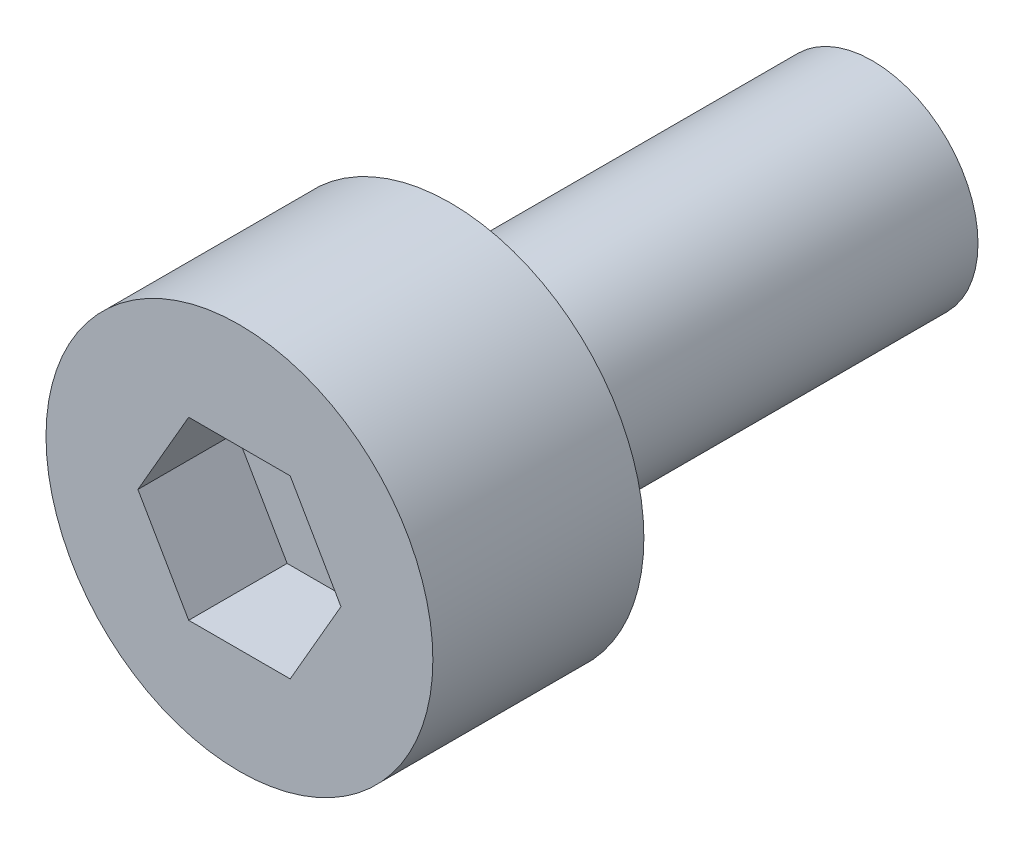
ISO-10303-21;
HEADER;
FILE_DESCRIPTION(('STEP AP214'),'2;1');
FILE_NAME('part.step','',(''),(''),'','','');
FILE_SCHEMA(('AUTOMOTIVE_DESIGN { 1 0 10303 214 1 1 1 1 }'));
ENDSEC;
DATA;
#1=APPLICATION_CONTEXT('core data for automotive mechanical design processes');
#2=APPLICATION_PROTOCOL_DEFINITION('international standard','automotive_design',2000,#1);
#3=PRODUCT_CONTEXT('',#1,'mechanical');
#4=PRODUCT('Part','Part','',(#3));
#5=PRODUCT_RELATED_PRODUCT_CATEGORY('part','',(#4));
#6=PRODUCT_DEFINITION_FORMATION('','',#4);
#7=PRODUCT_DEFINITION_CONTEXT('part definition',#1,'design');
#8=PRODUCT_DEFINITION('design','',#6,#7);
#9=PRODUCT_DEFINITION_SHAPE('','',#8);
#10=(LENGTH_UNIT() NAMED_UNIT(*) SI_UNIT(.MILLI.,.METRE.));
#11=(NAMED_UNIT(*) PLANE_ANGLE_UNIT() SI_UNIT($,.RADIAN.));
#12=(NAMED_UNIT(*) SI_UNIT($,.STERADIAN.) SOLID_ANGLE_UNIT());
#13=UNCERTAINTY_MEASURE_WITH_UNIT(LENGTH_MEASURE(1.E-05),#10,'distance_accuracy_value','');
#14=(GEOMETRIC_REPRESENTATION_CONTEXT(3) GLOBAL_UNCERTAINTY_ASSIGNED_CONTEXT((#13)) GLOBAL_UNIT_ASSIGNED_CONTEXT((#10,
#11,#12)) REPRESENTATION_CONTEXT('',''));
#15=CARTESIAN_POINT('',(0.,0.,0.));
#16=DIRECTION('',(0.,0.,1.));
#17=DIRECTION('',(1.,0.,0.));
#18=AXIS2_PLACEMENT_3D('',#15,#16,#17);
#19=CARTESIAN_POINT('',(0.,0.,3.));
#20=DIRECTION('',(0.,0.,1.));
#21=DIRECTION('',(1.,0.,0.));
#22=AXIS2_PLACEMENT_3D('',#19,#20,#21);
#23=PLANE('',#22);
#24=CARTESIAN_POINT('',(0.,0.,3.));
#25=DIRECTION('',(0.,0.,1.));
#26=DIRECTION('',(1.,0.,0.));
#27=AXIS2_PLACEMENT_3D('',#24,#25,#26);
#28=CIRCLE('',#27,2.75);
#29=CARTESIAN_POINT('',(2.75,0.,3.));
#30=VERTEX_POINT('',#29);
#31=EDGE_CURVE('E11',#30,#30,#28,.T.);
#32=ORIENTED_EDGE('',*,*,#31,.T.);
#33=EDGE_LOOP('',(#32));
#34=FACE_BOUND('',#33,.T.);
#35=DIRECTION('',(-0.5,0.866025403784439,0.));
#36=VECTOR('',#35,1.);
#37=CARTESIAN_POINT('',(1.44337567297406,0.,3.));
#38=LINE('',#37,#36);
#39=CARTESIAN_POINT('',(1.44337567297406,0.,3.));
#40=VERTEX_POINT('',#39);
#41=CARTESIAN_POINT('',(0.721687836487032,1.25,3.));
#42=VERTEX_POINT('',#41);
#43=EDGE_CURVE('E124',#40,#42,#38,.T.);
#44=ORIENTED_EDGE('',*,*,#43,.F.);
#45=DIRECTION('',(0.5,0.866025403784439,0.));
#46=VECTOR('',#45,1.);
#47=CARTESIAN_POINT('',(0.721687836487032,-1.25,3.));
#48=LINE('',#47,#46);
#49=CARTESIAN_POINT('',(0.721687836487032,-1.25,3.));
#50=VERTEX_POINT('',#49);
#51=EDGE_CURVE('E101',#50,#40,#48,.T.);
#52=ORIENTED_EDGE('',*,*,#51,.F.);
#53=DIRECTION('',(1.,0.,0.));
#54=VECTOR('',#53,1.);
#55=CARTESIAN_POINT('',(-0.721687836487033,-1.25,3.));
#56=LINE('',#55,#54);
#57=CARTESIAN_POINT('',(-0.721687836487033,-1.25,3.));
#58=VERTEX_POINT('',#57);
#59=EDGE_CURVE('E70',#58,#50,#56,.T.);
#60=ORIENTED_EDGE('',*,*,#59,.F.);
#61=DIRECTION('',(0.5,-0.866025403784439,0.));
#62=VECTOR('',#61,1.);
#63=CARTESIAN_POINT('',(-1.44337567297406,0.,3.));
#64=LINE('',#63,#62);
#65=CARTESIAN_POINT('',(-1.44337567297406,0.,3.));
#66=VERTEX_POINT('',#65);
#67=EDGE_CURVE('E135',#66,#58,#64,.T.);
#68=ORIENTED_EDGE('',*,*,#67,.F.);
#69=DIRECTION('',(-0.5,-0.866025403784439,0.));
#70=VECTOR('',#69,1.);
#71=CARTESIAN_POINT('',(-0.721687836487032,1.25,3.));
#72=LINE('',#71,#70);
#73=CARTESIAN_POINT('',(-0.721687836487032,1.25,3.));
#74=VERTEX_POINT('',#73);
#75=EDGE_CURVE('E122',#74,#66,#72,.T.);
#76=ORIENTED_EDGE('',*,*,#75,.F.);
#77=DIRECTION('',(-1.,0.,0.));
#78=VECTOR('',#77,1.);
#79=CARTESIAN_POINT('',(0.721687836487032,1.25,3.));
#80=LINE('',#79,#78);
#81=EDGE_CURVE('E109',#42,#74,#80,.T.);
#82=ORIENTED_EDGE('',*,*,#81,.F.);
#83=EDGE_LOOP('',(#44,#52,#60,#68,#76,#82));
#84=FACE_BOUND('',#83,.T.);
#85=ADVANCED_FACE('F50',(#34,#84),#23,.T.);
#86=CARTESIAN_POINT('',(0.,0.,3.));
#87=DIRECTION('',(0.,0.,-1.));
#88=DIRECTION('',(-1.,0.,0.));
#89=AXIS2_PLACEMENT_3D('',#86,#87,#88);
#90=CYLINDRICAL_SURFACE('',#89,2.75);
#91=ORIENTED_EDGE('',*,*,#31,.F.);
#92=EDGE_LOOP('',(#91));
#93=FACE_BOUND('',#92,.T.);
#94=CARTESIAN_POINT('',(0.,0.,0.));
#95=DIRECTION('',(0.,0.,1.));
#96=DIRECTION('',(1.,0.,0.));
#97=AXIS2_PLACEMENT_3D('',#94,#95,#96);
#98=CIRCLE('',#97,2.75);
#99=CARTESIAN_POINT('',(2.75,0.,0.));
#100=VERTEX_POINT('',#99);
#101=EDGE_CURVE('E51',#100,#100,#98,.T.);
#102=ORIENTED_EDGE('',*,*,#101,.T.);
#103=EDGE_LOOP('',(#102));
#104=FACE_BOUND('',#103,.T.);
#105=ADVANCED_FACE('F47',(#93,#104),#90,.T.);
#106=CARTESIAN_POINT('',(0.,0.,0.));
#107=DIRECTION('',(0.,0.,1.));
#108=DIRECTION('',(1.,0.,0.));
#109=AXIS2_PLACEMENT_3D('',#106,#107,#108);
#110=PLANE('',#109);
#111=CARTESIAN_POINT('',(0.,0.,0.));
#112=DIRECTION('',(0.,0.,1.));
#113=DIRECTION('',(1.,0.,0.));
#114=AXIS2_PLACEMENT_3D('',#111,#112,#113);
#115=CIRCLE('',#114,1.5);
#116=CARTESIAN_POINT('',(1.5,0.,0.));
#117=VERTEX_POINT('',#116);
#118=EDGE_CURVE('E156',#117,#117,#115,.T.);
#119=ORIENTED_EDGE('',*,*,#118,.T.);
#120=EDGE_LOOP('',(#119));
#121=FACE_BOUND('',#120,.T.);
#122=ORIENTED_EDGE('',*,*,#101,.F.);
#123=EDGE_LOOP('',(#122));
#124=FACE_BOUND('',#123,.T.);
#125=ADVANCED_FACE('F174',(#121,#124),#110,.F.);
#126=CARTESIAN_POINT('',(0.,0.,0.));
#127=DIRECTION('',(0.,0.,-1.));
#128=DIRECTION('',(-1.,0.,0.));
#129=AXIS2_PLACEMENT_3D('',#126,#127,#128);
#130=CYLINDRICAL_SURFACE('',#129,1.5);
#131=ORIENTED_EDGE('',*,*,#118,.F.);
#132=EDGE_LOOP('',(#131));
#133=FACE_BOUND('',#132,.T.);
#134=CARTESIAN_POINT('',(0.,0.,-6.));
#135=DIRECTION('',(0.,0.,1.));
#136=DIRECTION('',(1.,0.,0.));
#137=AXIS2_PLACEMENT_3D('',#134,#135,#136);
#138=CIRCLE('',#137,1.5);
#139=CARTESIAN_POINT('',(1.5,0.,-6.));
#140=VERTEX_POINT('',#139);
#141=EDGE_CURVE('E154',#140,#140,#138,.T.);
#142=ORIENTED_EDGE('',*,*,#141,.T.);
#143=EDGE_LOOP('',(#142));
#144=FACE_BOUND('',#143,.T.);
#145=ADVANCED_FACE('F165',(#133,#144),#130,.T.);
#146=CARTESIAN_POINT('',(0.,0.,-6.));
#147=DIRECTION('',(0.,0.,1.));
#148=DIRECTION('',(1.,0.,0.));
#149=AXIS2_PLACEMENT_3D('',#146,#147,#148);
#150=PLANE('',#149);
#151=ORIENTED_EDGE('',*,*,#141,.F.);
#152=EDGE_LOOP('',(#151));
#153=FACE_BOUND('',#152,.T.);
#154=ADVANCED_FACE('F163',(#153),#150,.F.);
#155=CARTESIAN_POINT('',(0.721687836487032,-1.25,3.));
#156=DIRECTION('',(-0.866025403784439,0.5,0.));
#157=DIRECTION('',(-0.5,-0.866025403784439,0.));
#158=AXIS2_PLACEMENT_3D('',#155,#156,#157);
#159=PLANE('',#158);
#160=DIRECTION('',(0.5,0.866025403784439,0.));
#161=VECTOR('',#160,1.);
#162=CARTESIAN_POINT('',(0.721687836487032,-1.25,1.6));
#163=LINE('',#162,#161);
#164=CARTESIAN_POINT('',(0.721687836487032,-1.25,1.6));
#165=VERTEX_POINT('',#164);
#166=CARTESIAN_POINT('',(1.44337567297406,0.,1.6));
#167=VERTEX_POINT('',#166);
#168=EDGE_CURVE('E136',#165,#167,#163,.T.);
#169=ORIENTED_EDGE('',*,*,#168,.F.);
#170=DIRECTION('',(0.,0.,-1.));
#171=VECTOR('',#170,1.);
#172=CARTESIAN_POINT('',(0.721687836487032,-1.25,3.));
#173=LINE('',#172,#171);
#174=EDGE_CURVE('E140',#50,#165,#173,.T.);
#175=ORIENTED_EDGE('',*,*,#174,.F.);
#176=ORIENTED_EDGE('',*,*,#51,.T.);
#177=DIRECTION('',(0.,0.,-1.));
#178=VECTOR('',#177,1.);
#179=CARTESIAN_POINT('',(1.44337567297406,0.,3.));
#180=LINE('',#179,#178);
#181=EDGE_CURVE('E153',#40,#167,#180,.T.);
#182=ORIENTED_EDGE('',*,*,#181,.T.);
#183=EDGE_LOOP('',(#169,#175,#176,#182));
#184=FACE_BOUND('',#183,.T.);
#185=ADVANCED_FACE('F167',(#184),#159,.T.);
#186=CARTESIAN_POINT('',(1.44337567297406,0.,3.));
#187=DIRECTION('',(-0.866025403784439,-0.5,0.));
#188=DIRECTION('',(0.5,-0.866025403784439,0.));
#189=AXIS2_PLACEMENT_3D('',#186,#187,#188);
#190=PLANE('',#189);
#191=DIRECTION('',(-0.5,0.866025403784439,0.));
#192=VECTOR('',#191,1.);
#193=CARTESIAN_POINT('',(1.44337567297406,0.,1.6));
#194=LINE('',#193,#192);
#195=CARTESIAN_POINT('',(0.721687836487032,1.25,1.6));
#196=VERTEX_POINT('',#195);
#197=EDGE_CURVE('E143',#167,#196,#194,.T.);
#198=ORIENTED_EDGE('',*,*,#197,.F.);
#199=ORIENTED_EDGE('',*,*,#181,.F.);
#200=ORIENTED_EDGE('',*,*,#43,.T.);
#201=DIRECTION('',(0.,0.,-1.));
#202=VECTOR('',#201,1.);
#203=CARTESIAN_POINT('',(0.721687836487032,1.25,3.));
#204=LINE('',#203,#202);
#205=EDGE_CURVE('E120',#42,#196,#204,.T.);
#206=ORIENTED_EDGE('',*,*,#205,.T.);
#207=EDGE_LOOP('',(#198,#199,#200,#206));
#208=FACE_BOUND('',#207,.T.);
#209=ADVANCED_FACE('F175',(#208),#190,.T.);
#210=CARTESIAN_POINT('',(0.721687836487032,1.25,3.));
#211=DIRECTION('',(0.,-1.,0.));
#212=DIRECTION('',(1.,0.,0.));
#213=AXIS2_PLACEMENT_3D('',#210,#211,#212);
#214=PLANE('',#213);
#215=DIRECTION('',(-1.,0.,0.));
#216=VECTOR('',#215,1.);
#217=CARTESIAN_POINT('',(0.721687836487032,1.25,1.6));
#218=LINE('',#217,#216);
#219=CARTESIAN_POINT('',(-0.721687836487032,1.25,1.6));
#220=VERTEX_POINT('',#219);
#221=EDGE_CURVE('E141',#196,#220,#218,.T.);
#222=ORIENTED_EDGE('',*,*,#221,.F.);
#223=ORIENTED_EDGE('',*,*,#205,.F.);
#224=ORIENTED_EDGE('',*,*,#81,.T.);
#225=DIRECTION('',(0.,0.,-1.));
#226=VECTOR('',#225,1.);
#227=CARTESIAN_POINT('',(-0.721687836487032,1.25,3.));
#228=LINE('',#227,#226);
#229=EDGE_CURVE('E111',#74,#220,#228,.T.);
#230=ORIENTED_EDGE('',*,*,#229,.T.);
#231=EDGE_LOOP('',(#222,#223,#224,#230));
#232=FACE_BOUND('',#231,.T.);
#233=ADVANCED_FACE('F114',(#232),#214,.T.);
#234=CARTESIAN_POINT('',(-0.721687836487032,1.25,3.));
#235=DIRECTION('',(0.866025403784438,-0.5,0.));
#236=DIRECTION('',(0.5,0.866025403784439,0.));
#237=AXIS2_PLACEMENT_3D('',#234,#235,#236);
#238=PLANE('',#237);
#239=DIRECTION('',(-0.5,-0.866025403784439,0.));
#240=VECTOR('',#239,1.);
#241=CARTESIAN_POINT('',(-0.721687836487032,1.25,1.6));
#242=LINE('',#241,#240);
#243=CARTESIAN_POINT('',(-1.44337567297406,0.,1.6));
#244=VERTEX_POINT('',#243);
#245=EDGE_CURVE('E126',#220,#244,#242,.T.);
#246=ORIENTED_EDGE('',*,*,#245,.F.);
#247=ORIENTED_EDGE('',*,*,#229,.F.);
#248=ORIENTED_EDGE('',*,*,#75,.T.);
#249=DIRECTION('',(0.,0.,-1.));
#250=VECTOR('',#249,1.);
#251=CARTESIAN_POINT('',(-1.44337567297406,0.,3.));
#252=LINE('',#251,#250);
#253=EDGE_CURVE('E129',#66,#244,#252,.T.);
#254=ORIENTED_EDGE('',*,*,#253,.T.);
#255=EDGE_LOOP('',(#246,#247,#248,#254));
#256=FACE_BOUND('',#255,.T.);
#257=ADVANCED_FACE('F123',(#256),#238,.T.);
#258=CARTESIAN_POINT('',(-1.44337567297406,0.,3.));
#259=DIRECTION('',(0.866025403784439,0.5,0.));
#260=DIRECTION('',(-0.5,0.866025403784439,0.));
#261=AXIS2_PLACEMENT_3D('',#258,#259,#260);
#262=PLANE('',#261);
#263=DIRECTION('',(0.5,-0.866025403784439,0.));
#264=VECTOR('',#263,1.);
#265=CARTESIAN_POINT('',(-1.44337567297406,0.,1.6));
#266=LINE('',#265,#264);
#267=CARTESIAN_POINT('',(-0.721687836487033,-1.25,1.6));
#268=VERTEX_POINT('',#267);
#269=EDGE_CURVE('E148',#244,#268,#266,.T.);
#270=ORIENTED_EDGE('',*,*,#269,.F.);
#271=ORIENTED_EDGE('',*,*,#253,.F.);
#272=ORIENTED_EDGE('',*,*,#67,.T.);
#273=DIRECTION('',(0.,0.,-1.));
#274=VECTOR('',#273,1.);
#275=CARTESIAN_POINT('',(-0.721687836487033,-1.25,3.));
#276=LINE('',#275,#274);
#277=EDGE_CURVE('E65',#58,#268,#276,.T.);
#278=ORIENTED_EDGE('',*,*,#277,.T.);
#279=EDGE_LOOP('',(#270,#271,#272,#278));
#280=FACE_BOUND('',#279,.T.);
#281=ADVANCED_FACE('F277',(#280),#262,.T.);
#282=CARTESIAN_POINT('',(-0.721687836487033,-1.25,3.));
#283=DIRECTION('',(0.,1.,0.));
#284=DIRECTION('',(-1.,0.,0.));
#285=AXIS2_PLACEMENT_3D('',#282,#283,#284);
#286=PLANE('',#285);
#287=DIRECTION('',(1.,0.,0.));
#288=VECTOR('',#287,1.);
#289=CARTESIAN_POINT('',(-0.721687836487033,-1.25,1.6));
#290=LINE('',#289,#288);
#291=EDGE_CURVE('E94',#268,#165,#290,.T.);
#292=ORIENTED_EDGE('',*,*,#291,.F.);
#293=ORIENTED_EDGE('',*,*,#277,.F.);
#294=ORIENTED_EDGE('',*,*,#59,.T.);
#295=ORIENTED_EDGE('',*,*,#174,.T.);
#296=EDGE_LOOP('',(#292,#293,#294,#295));
#297=FACE_BOUND('',#296,.T.);
#298=ADVANCED_FACE('F282',(#297),#286,.T.);
#299=CARTESIAN_POINT('',(0.,0.,1.6));
#300=DIRECTION('',(0.,0.,1.));
#301=DIRECTION('',(1.,0.,0.));
#302=AXIS2_PLACEMENT_3D('',#299,#300,#301);
#303=PLANE('',#302);
#304=ORIENTED_EDGE('',*,*,#168,.T.);
#305=ORIENTED_EDGE('',*,*,#197,.T.);
#306=ORIENTED_EDGE('',*,*,#221,.T.);
#307=ORIENTED_EDGE('',*,*,#245,.T.);
#308=ORIENTED_EDGE('',*,*,#269,.T.);
#309=ORIENTED_EDGE('',*,*,#291,.T.);
#310=EDGE_LOOP('',(#304,#305,#306,#307,#308,#309));
#311=FACE_BOUND('',#310,.T.);
#312=ADVANCED_FACE('F293',(#311),#303,.T.);
#313=CLOSED_SHELL('',(#85,#105,#125,#145,#154,#185,#209,#233,#257,#281,#298,#312));
#314=MANIFOLD_SOLID_BREP('B2',#313);
#315=ADVANCED_BREP_SHAPE_REPRESENTATION('',(#18,#314),#14);
#316=SHAPE_DEFINITION_REPRESENTATION(#9,#315);
ENDSEC;
END-ISO-10303-21;
